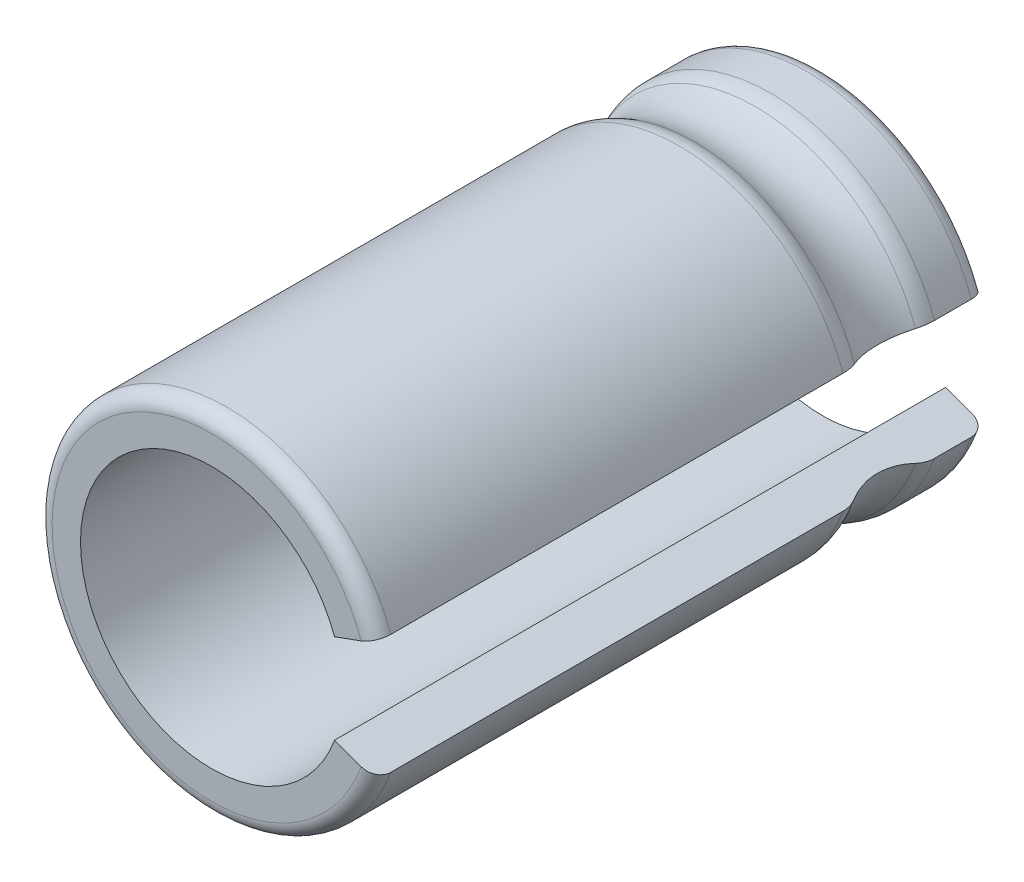
ISO-10303-21;
HEADER;
FILE_DESCRIPTION(('STEP AP214'),'2;1');
FILE_NAME('part.step','',(''),(''),'','','');
FILE_SCHEMA(('AUTOMOTIVE_DESIGN { 1 0 10303 214 1 1 1 1 }'));
ENDSEC;
DATA;
#1=APPLICATION_CONTEXT('core data for automotive mechanical design processes');
#2=APPLICATION_PROTOCOL_DEFINITION('international standard','automotive_design',2000,#1);
#3=PRODUCT_CONTEXT('',#1,'mechanical');
#4=PRODUCT('Part','Part','',(#3));
#5=PRODUCT_RELATED_PRODUCT_CATEGORY('part','',(#4));
#6=PRODUCT_DEFINITION_FORMATION('','',#4);
#7=PRODUCT_DEFINITION_CONTEXT('part definition',#1,'design');
#8=PRODUCT_DEFINITION('design','',#6,#7);
#9=PRODUCT_DEFINITION_SHAPE('','',#8);
#10=(LENGTH_UNIT() NAMED_UNIT(*) SI_UNIT(.MILLI.,.METRE.));
#11=(NAMED_UNIT(*) PLANE_ANGLE_UNIT() SI_UNIT($,.RADIAN.));
#12=(NAMED_UNIT(*) SI_UNIT($,.STERADIAN.) SOLID_ANGLE_UNIT());
#13=UNCERTAINTY_MEASURE_WITH_UNIT(LENGTH_MEASURE(1.E-05),#10,'distance_accuracy_value','');
#14=(GEOMETRIC_REPRESENTATION_CONTEXT(3) GLOBAL_UNCERTAINTY_ASSIGNED_CONTEXT((#13)) GLOBAL_UNIT_ASSIGNED_CONTEXT((#10,
#11,#12)) REPRESENTATION_CONTEXT('',''));
#15=CARTESIAN_POINT('',(0.,0.,0.));
#16=DIRECTION('',(0.,0.,1.));
#17=DIRECTION('',(1.,0.,0.));
#18=AXIS2_PLACEMENT_3D('',#15,#16,#17);
#19=CARTESIAN_POINT('',(-6.44883452194378E-13,0.,1.117236171027));
#20=DIRECTION('',(0.,0.,1.));
#21=DIRECTION('',(1.,0.,0.));
#22=AXIS2_PLACEMENT_3D('',#19,#20,#21);
#23=TOROIDAL_SURFACE('',#22,1.65000000000678,0.349999999994139);
#24=CARTESIAN_POINT('',(0.,0.,1.291846849077));
#25=DIRECTION('',(0.,0.,-1.));
#26=DIRECTION('',(0.,1.,0.));
#27=AXIS2_PLACEMENT_3D('',#24,#25,#26);
#28=CIRCLE('',#27,1.95333333333273);
#29=CARTESIAN_POINT('',(1.83553291926836,-0.668079346629729,1.29184684907559));
#30=VERTEX_POINT('',#29);
#31=CARTESIAN_POINT('',(1.83553291926847,0.668079346629759,1.29184684907565));
#32=VERTEX_POINT('',#31);
#33=EDGE_CURVE('E91',#30,#32,#28,.T.);
#34=ORIENTED_EDGE('',*,*,#33,.T.);
#35=CARTESIAN_POINT('',(1.55049282430246,0.564333236489703,1.117236171027));
#36=DIRECTION('',(0.342020143325687,-0.939692620785902,0.));
#37=DIRECTION('',(0.939692620785902,0.342020143325687,0.));
#38=AXIS2_PLACEMENT_3D('',#35,#36,#37);
#39=CIRCLE('',#38,0.349999999994139);
#40=CARTESIAN_POINT('',(1.87938524157191,0.684040286651308,1.117236171027));
#41=VERTEX_POINT('',#40);
#42=EDGE_CURVE('E21',#32,#41,#39,.F.);
#43=ORIENTED_EDGE('',*,*,#42,.T.);
#44=CARTESIAN_POINT('',(0.,0.,1.117236171027));
#45=DIRECTION('',(0.,0.,1.));
#46=DIRECTION('',(1.,0.,0.));
#47=AXIS2_PLACEMENT_3D('',#44,#45,#46);
#48=CIRCLE('',#47,2.);
#49=CARTESIAN_POINT('',(1.87938524157191,-0.684040286651314,1.117236171027));
#50=VERTEX_POINT('',#49);
#51=EDGE_CURVE('E143',#50,#41,#48,.F.);
#52=ORIENTED_EDGE('',*,*,#51,.F.);
#53=CARTESIAN_POINT('',(1.55049282430246,-0.564333236489712,1.117236171027));
#54=DIRECTION('',(-0.342020143325693,-0.9396926207859,0.));
#55=DIRECTION('',(0.9396926207859,-0.342020143325693,0.));
#56=AXIS2_PLACEMENT_3D('',#53,#54,#55);
#57=CIRCLE('',#56,0.349999999994139);
#58=EDGE_CURVE('E97',#50,#30,#57,.T.);
#59=ORIENTED_EDGE('',*,*,#58,.T.);
#60=EDGE_LOOP('',(#34,#43,#52,#59));
#61=FACE_BOUND('',#60,.T.);
#62=ADVANCED_FACE('F17',(#61),#23,.T.);
#63=CARTESIAN_POINT('',(0.,0.,1.6410682051755));
#64=DIRECTION('',(0.,0.,1.));
#65=DIRECTION('',(0.,-1.,0.));
#66=AXIS2_PLACEMENT_3D('',#63,#64,#65);
#67=TOROIDAL_SURFACE('',#66,2.56000000000191,0.700000000001982);
#68=ORIENTED_EDGE('',*,*,#33,.F.);
#69=CARTESIAN_POINT('',(2.4056131092136,-0.875571566914685,1.6410682051755));
#70=DIRECTION('',(-0.342020143325795,-0.939692620785862,0.));
#71=DIRECTION('',(0.939692620785863,-0.342020143325795,0.));
#72=AXIS2_PLACEMENT_3D('',#69,#70,#71);
#73=CIRCLE('',#72,0.700000000001982);
#74=CARTESIAN_POINT('',(1.83553291926836,-0.668079346629693,1.99028956127535));
#75=VERTEX_POINT('',#74);
#76=EDGE_CURVE('E101',#75,#30,#73,.T.);
#77=ORIENTED_EDGE('',*,*,#76,.F.);
#78=CARTESIAN_POINT('',(-6.41847686111419E-13,0.,1.990289561274));
#79=DIRECTION('',(0.,0.,1.));
#80=DIRECTION('',(1.,0.,0.));
#81=AXIS2_PLACEMENT_3D('',#78,#79,#80);
#82=CIRCLE('',#81,1.95333333333284);
#83=CARTESIAN_POINT('',(1.83553291926826,0.668079346629654,1.99028956127541));
#84=VERTEX_POINT('',#83);
#85=EDGE_CURVE('E107',#84,#75,#82,.T.);
#86=ORIENTED_EDGE('',*,*,#85,.F.);
#87=CARTESIAN_POINT('',(2.40561310921361,0.875571566914684,1.6410682051755));
#88=DIRECTION('',(0.342020143325793,-0.939692620785863,0.));
#89=DIRECTION('',(0.939692620785863,0.342020143325793,0.));
#90=AXIS2_PLACEMENT_3D('',#87,#88,#89);
#91=CIRCLE('',#90,0.700000000001982);
#92=EDGE_CURVE('E104',#32,#84,#91,.F.);
#93=ORIENTED_EDGE('',*,*,#92,.F.);
#94=EDGE_LOOP('',(#68,#77,#86,#93));
#95=FACE_BOUND('',#94,.T.);
#96=ADVANCED_FACE('F105',(#95),#67,.F.);
#97=CARTESIAN_POINT('',(0.,0.,0.871068205175));
#98=DIRECTION('',(0.,0.,1.));
#99=DIRECTION('',(1.,0.,0.));
#100=AXIS2_PLACEMENT_3D('',#97,#98,#99);
#101=CYLINDRICAL_SURFACE('',#100,2.);
#102=ORIENTED_EDGE('',*,*,#51,.T.);
#103=DIRECTION('',(0.,0.,1.));
#104=VECTOR('',#103,1.);
#105=CARTESIAN_POINT('',(1.87938524157195,0.684040286650981,0.871068205175));
#106=LINE('',#105,#104);
#107=CARTESIAN_POINT('',(1.879385241572,0.684040286651346,0.696068205175));
#108=VERTEX_POINT('',#107);
#109=EDGE_CURVE('E114',#41,#108,#106,.F.);
#110=ORIENTED_EDGE('',*,*,#109,.T.);
#111=CARTESIAN_POINT('',(8.56086035394554E-13,0.,0.696068205175));
#112=DIRECTION('',(0.,0.,-1.));
#113=DIRECTION('',(-1.,0.,0.));
#114=AXIS2_PLACEMENT_3D('',#111,#112,#113);
#115=CIRCLE('',#114,2.00000000000005);
#116=CARTESIAN_POINT('',(1.879385241572,-0.684040286651347,0.696068205175));
#117=VERTEX_POINT('',#116);
#118=EDGE_CURVE('E123',#117,#108,#115,.T.);
#119=ORIENTED_EDGE('',*,*,#118,.F.);
#120=DIRECTION('',(0.,0.,1.));
#121=VECTOR('',#120,1.);
#122=CARTESIAN_POINT('',(1.87938524157195,-0.684040286650982,0.871068205175));
#123=LINE('',#122,#121);
#124=EDGE_CURVE('E100',#117,#50,#123,.T.);
#125=ORIENTED_EDGE('',*,*,#124,.T.);
#126=EDGE_LOOP('',(#102,#110,#119,#125));
#127=FACE_BOUND('',#126,.T.);
#128=ADVANCED_FACE('F185',(#127),#101,.T.);
#129=CARTESIAN_POINT('',(8.56086035394554E-13,0.,2.164900239324));
#130=DIRECTION('',(0.,0.,1.));
#131=DIRECTION('',(1.,0.,0.));
#132=AXIS2_PLACEMENT_3D('',#129,#130,#131);
#133=TOROIDAL_SURFACE('',#132,1.65000000000537,0.34999999999414);
#134=CARTESIAN_POINT('',(1.55049282430249,-0.564333236489628,2.164900239324));
#135=DIRECTION('',(-0.342020143325935,-0.939692620785812,0.));
#136=DIRECTION('',(0.939692620785812,-0.342020143325935,0.));
#137=AXIS2_PLACEMENT_3D('',#134,#135,#136);
#138=CIRCLE('',#137,0.34999999999414);
#139=CARTESIAN_POINT('',(1.87938524157182,-0.68404028665163,2.164900239324));
#140=VERTEX_POINT('',#139);
#141=EDGE_CURVE('E119',#75,#140,#138,.T.);
#142=ORIENTED_EDGE('',*,*,#141,.T.);
#143=CARTESIAN_POINT('',(0.,0.,2.164900239324));
#144=DIRECTION('',(0.,0.,1.));
#145=DIRECTION('',(1.,0.,0.));
#146=AXIS2_PLACEMENT_3D('',#143,#144,#145);
#147=CIRCLE('',#146,2.);
#148=CARTESIAN_POINT('',(1.87938524157182,0.684040286651629,2.164900239324));
#149=VERTEX_POINT('',#148);
#150=EDGE_CURVE('E152',#149,#140,#147,.T.);
#151=ORIENTED_EDGE('',*,*,#150,.F.);
#152=CARTESIAN_POINT('',(1.55049282430249,0.564333236489627,2.164900239324));
#153=DIRECTION('',(0.342020143325934,-0.939692620785812,0.));
#154=DIRECTION('',(0.939692620785812,0.342020143325934,0.));
#155=AXIS2_PLACEMENT_3D('',#152,#153,#154);
#156=CIRCLE('',#155,0.34999999999414);
#157=EDGE_CURVE('E117',#149,#84,#156,.F.);
#158=ORIENTED_EDGE('',*,*,#157,.T.);
#159=ORIENTED_EDGE('',*,*,#85,.T.);
#160=EDGE_LOOP('',(#142,#151,#158,#159));
#161=FACE_BOUND('',#160,.T.);
#162=ADVANCED_FACE('F188',(#161),#133,.T.);
#163=CARTESIAN_POINT('',(8.56086035394554E-13,0.,0.696068205175));
#164=DIRECTION('',(0.,0.,1.));
#165=DIRECTION('',(1.,0.,0.));
#166=AXIS2_PLACEMENT_3D('',#163,#164,#165);
#167=TOROIDAL_SURFACE('',#166,1.82499999999881,0.175000000000221);
#168=CARTESIAN_POINT('',(1.71493903293384,-0.624186761569423,0.696068205175));
#169=DIRECTION('',(-0.342020143325935,-0.939692620785812,0.));
#170=DIRECTION('',(0.939692620785812,-0.342020143325935,0.));
#171=AXIS2_PLACEMENT_3D('',#168,#169,#170);
#172=CIRCLE('',#171,0.175000000000221);
#173=CARTESIAN_POINT('',(1.71493903293392,-0.624186761569212,0.521068205174999));
#174=VERTEX_POINT('',#173);
#175=EDGE_CURVE('E121',#174,#117,#172,.T.);
#176=ORIENTED_EDGE('',*,*,#175,.T.);
#177=ORIENTED_EDGE('',*,*,#118,.T.);
#178=CARTESIAN_POINT('',(1.71493903293385,0.624186761569423,0.696068205175));
#179=DIRECTION('',(0.342020143325933,-0.939692620785812,0.));
#180=DIRECTION('',(0.939692620785812,0.342020143325933,0.));
#181=AXIS2_PLACEMENT_3D('',#178,#179,#180);
#182=CIRCLE('',#181,0.175000000000221);
#183=CARTESIAN_POINT('',(1.71493903293392,0.624186761569211,0.521068205175));
#184=VERTEX_POINT('',#183);
#185=EDGE_CURVE('E124',#108,#184,#182,.F.);
#186=ORIENTED_EDGE('',*,*,#185,.T.);
#187=CARTESIAN_POINT('',(1.714939032934,-0.624186761569,0.521068205175));
#188=CARTESIAN_POINT('',(1.60823336737907,-0.916844181244438,0.521068205175));
#189=CARTESIAN_POINT('',(1.41080893173933,-1.15768871382733,0.521068205175));
#190=CARTESIAN_POINT('',(1.20088478741226,-1.41378205027014,0.521068205175));
#191=CARTESIAN_POINT('',(0.912500000000333,-1.58049636190633,0.521068205175));
#192=CARTESIAN_POINT('',(0.625879270241386,-1.74619087752644,0.521068205175));
#193=CARTESIAN_POINT('',(0.297183369979049,-1.80064073168644,0.521068205175));
#194=CARTESIAN_POINT('',(-0.00906607807898432,-1.85137223691676,0.521068205175));
#195=CARTESIAN_POINT('',(-0.316907924241667,-1.79727414924767,0.521068205175));
#196=CARTESIAN_POINT('',(-0.622715286092148,-1.74353358838026,0.521068205175));
#197=CARTESIAN_POINT('',(-0.895116420919333,-1.59040610945811,0.521068205175));
#198=CARTESIAN_POINT('',(-1.18377207209215,-1.42814132238677,0.521068205175));
#199=CARTESIAN_POINT('',(-1.39803110869233,-1.17308738767833,0.521068205175));
#200=CARTESIAN_POINT('',(-1.61097951970848,-0.919593621527738,0.521068205175));
#201=CARTESIAN_POINT('',(-1.72167960232422,-0.605346468512333,0.521068205175));
#202=CARTESIAN_POINT('',(-1.82482004056398,-0.312559071143259,0.521068205175));
#203=CARTESIAN_POINT('',(-1.82499999999967,-3.33392168039293E-13,0.521068205175));
#204=CARTESIAN_POINT('',(-1.82517877010826,0.310493411338437,0.521068205175));
#205=CARTESIAN_POINT('',(-1.72167960232444,0.605346468512444,0.521068205175));
#206=CARTESIAN_POINT('',(-1.61200450977718,0.917793776310604,0.521068205175));
#207=CARTESIAN_POINT('',(-1.398031108692,1.17308738767833,0.521068205175));
#208=CARTESIAN_POINT('',(-1.18536658595716,1.42681936437929,0.521068205175));
#209=CARTESIAN_POINT('',(-0.895116420919778,1.59040610945744,0.521068205175));
#210=CARTESIAN_POINT('',(-0.624687271153769,1.74282161068128,0.521068205175));
#211=CARTESIAN_POINT('',(-0.316907924242333,1.79727414924733,0.521068205175));
#212=CARTESIAN_POINT('',(-0.011162648604146,1.85136681849284,0.521068205175));
#213=CARTESIAN_POINT('',(0.297183369979111,1.80064073168589,0.521068205175));
#214=CARTESIAN_POINT('',(0.623928781065602,1.74688775584822,0.521068205175));
#215=CARTESIAN_POINT('',(0.912499999999667,1.580496361907,0.521068205175));
#216=CARTESIAN_POINT('',(1.19930624974728,1.41512265671617,0.521068205175));
#217=CARTESIAN_POINT('',(1.41080893173933,1.15768871382778,0.521068205175));
#218=CARTESIAN_POINT('',(1.6078759071354,0.917825426934783,0.521068205175));
#219=CARTESIAN_POINT('',(1.714939032934,0.624186761569,0.521068205175));
#220=B_SPLINE_CURVE_WITH_KNOTS('',2,(#187,#188,#189,#190,#191,#192,#193,#194,#195,#196,#197,
#198,#199,#200,#201,#202,#203,#204,#205,#206,#207,#208,#209,#210,#211,#212,#213,#214,#215,#216,
#217,#218,#219),.UNSPECIFIED.,.F.,.F.,(3,2,2,2,2,2,2,2,2,2,2,2,2,2,2,2,3),(0.,0.0625,0.125,
0.1875,0.25,0.3125,0.375,0.4375,0.5,0.5625,0.625,0.6875,0.75,0.8125,0.875,0.9375,1.),.UNSPECIFIED.);
#221=EDGE_CURVE('E158',#174,#184,#220,.T.);
#222=ORIENTED_EDGE('',*,*,#221,.F.);
#223=EDGE_LOOP('',(#176,#177,#186,#222));
#224=FACE_BOUND('',#223,.T.);
#225=ADVANCED_FACE('F183',(#224),#167,.T.);
#226=CARTESIAN_POINT('',(0.,0.,4.791068205175));
#227=DIRECTION('',(0.,0.,1.));
#228=DIRECTION('',(1.,0.,0.));
#229=AXIS2_PLACEMENT_3D('',#226,#227,#228);
#230=CYLINDRICAL_SURFACE('',#229,2.);
#231=ORIENTED_EDGE('',*,*,#150,.T.);
#232=DIRECTION('',(0.,0.,1.));
#233=VECTOR('',#232,1.);
#234=CARTESIAN_POINT('',(1.87938524157178,-0.684040286651612,4.047429708675));
#235=LINE('',#234,#233);
#236=CARTESIAN_POINT('',(1.87938524157191,-0.684040286651662,7.346068205175));
#237=VERTEX_POINT('',#236);
#238=EDGE_CURVE('E135',#237,#140,#235,.F.);
#239=ORIENTED_EDGE('',*,*,#238,.F.);
#240=CARTESIAN_POINT('',(8.52508168225352E-13,0.,7.346068205175));
#241=DIRECTION('',(0.,0.,1.));
#242=DIRECTION('',(1.,0.,0.));
#243=AXIS2_PLACEMENT_3D('',#240,#241,#242);
#244=CIRCLE('',#243,2.00000000000005);
#245=CARTESIAN_POINT('',(1.87938524157192,0.684040286651652,7.346068205175));
#246=VERTEX_POINT('',#245);
#247=EDGE_CURVE('E128',#246,#237,#244,.T.);
#248=ORIENTED_EDGE('',*,*,#247,.F.);
#249=DIRECTION('',(0.,0.,1.));
#250=VECTOR('',#249,1.);
#251=CARTESIAN_POINT('',(1.87938524157178,0.684040286651612,4.047429708675));
#252=LINE('',#251,#250);
#253=EDGE_CURVE('E131',#246,#149,#252,.F.);
#254=ORIENTED_EDGE('',*,*,#253,.T.);
#255=EDGE_LOOP('',(#231,#239,#248,#254));
#256=FACE_BOUND('',#255,.T.);
#257=ADVANCED_FACE('F180',(#256),#230,.T.);
#258=CARTESIAN_POINT('',(2.1618991319361E-13,0.,7.346068205175));
#259=DIRECTION('',(0.,0.,1.));
#260=DIRECTION('',(1.,0.,0.));
#261=AXIS2_PLACEMENT_3D('',#258,#259,#260);
#262=TOROIDAL_SURFACE('',#261,1.82499999999941,0.175000000000219);
#263=CARTESIAN_POINT('',(1.71493903293384,-0.624186761569442,7.346068205175));
#264=DIRECTION('',(-0.342020143325831,-0.939692620785849,0.));
#265=DIRECTION('',(0.939692620785849,-0.342020143325831,0.));
#266=AXIS2_PLACEMENT_3D('',#263,#264,#265);
#267=CIRCLE('',#266,0.175000000000219);
#268=CARTESIAN_POINT('',(1.71493903293392,-0.624186761569221,7.521068205175));
#269=VERTEX_POINT('',#268);
#270=EDGE_CURVE('E132',#269,#237,#267,.F.);
#271=ORIENTED_EDGE('',*,*,#270,.F.);
#272=CARTESIAN_POINT('',(1.714939032934,0.624186761569,7.521068205175));
#273=CARTESIAN_POINT('',(1.60823336738095,0.916844181242246,7.521068205175));
#274=CARTESIAN_POINT('',(1.41080893173922,1.15768871382744,7.521068205175));
#275=CARTESIAN_POINT('',(1.20088478741176,1.41378205027059,7.521068205175));
#276=CARTESIAN_POINT('',(0.912499999999667,1.58049636190633,7.521068205175));
#277=CARTESIAN_POINT('',(0.625879270239011,1.74619087752688,7.521068205175));
#278=CARTESIAN_POINT('',(0.297183369979021,1.80064073168644,7.521068205175));
#279=CARTESIAN_POINT('',(-0.00906607807896697,1.8513722369167,7.521068205175));
#280=CARTESIAN_POINT('',(-0.316907924242333,1.79727414924767,7.521068205175));
#281=CARTESIAN_POINT('',(-0.622715286091572,1.74353358838065,7.521068205175));
#282=CARTESIAN_POINT('',(-0.895116420919333,1.59040610945811,7.521068205175));
#283=CARTESIAN_POINT('',(-1.18377207209228,1.42814132238663,7.521068205175));
#284=CARTESIAN_POINT('',(-1.39803110869233,1.17308738767833,7.521068205175));
#285=CARTESIAN_POINT('',(-1.61097951970824,0.919593621528018,7.521068205175));
#286=CARTESIAN_POINT('',(-1.72167960232422,0.605346468512333,7.521068205175));
#287=CARTESIAN_POINT('',(-1.82482004056398,0.312559071143624,7.521068205175));
#288=CARTESIAN_POINT('',(-1.82499999999967,0.,7.521068205175));
#289=CARTESIAN_POINT('',(-1.82517877010826,-0.310493411339977,7.521068205175));
#290=CARTESIAN_POINT('',(-1.72167960232444,-0.605346468512333,7.521068205175));
#291=CARTESIAN_POINT('',(-1.61200450977616,-0.917793776311661,7.521068205175));
#292=CARTESIAN_POINT('',(-1.398031108692,-1.17308738767833,7.521068205175));
#293=CARTESIAN_POINT('',(-1.18536658595618,-1.42681936438063,7.521068205175));
#294=CARTESIAN_POINT('',(-0.895116420919667,-1.59040610945744,7.521068205175));
#295=CARTESIAN_POINT('',(-0.624687271151238,-1.74282161068185,7.521068205175));
#296=CARTESIAN_POINT('',(-0.316907924242333,-1.79727414924733,7.521068205175));
#297=CARTESIAN_POINT('',(-0.0111626486069413,-1.85136681849222,7.521068205175));
#298=CARTESIAN_POINT('',(0.297183369979111,-1.800640731686,7.521068205175));
#299=CARTESIAN_POINT('',(0.623928781062265,-1.74688775585015,7.521068205175));
#300=CARTESIAN_POINT('',(0.912499999999667,-1.580496361907,7.521068205175));
#301=CARTESIAN_POINT('',(1.19930624974923,-1.41512265671505,7.521068205175));
#302=CARTESIAN_POINT('',(1.41080893173933,-1.15768871382767,7.521068205175));
#303=CARTESIAN_POINT('',(1.60787590713898,-0.917825426929035,7.521068205175));
#304=CARTESIAN_POINT('',(1.714939032934,-0.624186761569,7.521068205175));
#305=B_SPLINE_CURVE_WITH_KNOTS('',2,(#272,#273,#274,#275,#276,#277,#278,#279,#280,#281,#282,
#283,#284,#285,#286,#287,#288,#289,#290,#291,#292,#293,#294,#295,#296,#297,#298,#299,#300,#301,
#302,#303,#304),.UNSPECIFIED.,.F.,.F.,(3,2,2,2,2,2,2,2,2,2,2,2,2,2,2,2,3),(0.,0.0625,0.125,
0.1875,0.25,0.3125,0.375,0.4375,0.5,0.5625,0.625,0.6875,0.75,0.8125,0.875,0.9375,1.),.UNSPECIFIED.);
#306=CARTESIAN_POINT('',(1.71493903293392,0.624186761569212,7.521068205175));
#307=VERTEX_POINT('',#306);
#308=EDGE_CURVE('E212',#307,#269,#305,.T.);
#309=ORIENTED_EDGE('',*,*,#308,.F.);
#310=CARTESIAN_POINT('',(1.71493903293385,0.624186761569424,7.346068205175));
#311=DIRECTION('',(0.342020143325821,-0.939692620785853,0.));
#312=DIRECTION('',(0.939692620785853,0.342020143325821,0.));
#313=AXIS2_PLACEMENT_3D('',#310,#311,#312);
#314=CIRCLE('',#313,0.175000000000219);
#315=EDGE_CURVE('E127',#307,#246,#314,.F.);
#316=ORIENTED_EDGE('',*,*,#315,.T.);
#317=ORIENTED_EDGE('',*,*,#247,.T.);
#318=EDGE_LOOP('',(#271,#309,#316,#317));
#319=FACE_BOUND('',#318,.T.);
#320=ADVANCED_FACE('F19',(#319),#262,.T.);
#321=CARTESIAN_POINT('',(1.637893575607,0.596144508417,4.047429708675));
#322=DIRECTION('',(-0.342020143325932,0.939692620785813,0.));
#323=DIRECTION('',(-0.939692620785813,-0.342020143325932,0.));
#324=AXIS2_PLACEMENT_3D('',#321,#322,#323);
#325=PLANE('',#324);
#326=ORIENTED_EDGE('',*,*,#157,.F.);
#327=ORIENTED_EDGE('',*,*,#253,.F.);
#328=ORIENTED_EDGE('',*,*,#315,.F.);
#329=DIRECTION('',(0.93969262078659,0.342020143323796,0.));
#330=VECTOR('',#329,1.);
#331=CARTESIAN_POINT('',(1.409538931179,0.513030214989,7.521068205175));
#332=LINE('',#331,#330);
#333=CARTESIAN_POINT('',(1.40953893117872,0.513030214988898,7.521068205175));
#334=VERTEX_POINT('',#333);
#335=EDGE_CURVE('E215',#334,#307,#332,.T.);
#336=ORIENTED_EDGE('',*,*,#335,.F.);
#337=DIRECTION('',(0.,0.,1.));
#338=VECTOR('',#337,1.);
#339=CARTESIAN_POINT('',(1.40953893117872,0.513030214988898,4.021068205175));
#340=LINE('',#339,#338);
#341=CARTESIAN_POINT('',(1.40953893117872,0.513030214988898,0.521068205175));
#342=VERTEX_POINT('',#341);
#343=EDGE_CURVE('E139',#334,#342,#340,.F.);
#344=ORIENTED_EDGE('',*,*,#343,.T.);
#345=DIRECTION('',(-0.93969262078659,-0.342020143323796,0.));
#346=VECTOR('',#345,1.);
#347=CARTESIAN_POINT('',(1.714939032934,0.624186761569,0.521068205175));
#348=LINE('',#347,#346);
#349=EDGE_CURVE('E159',#184,#342,#348,.T.);
#350=ORIENTED_EDGE('',*,*,#349,.F.);
#351=ORIENTED_EDGE('',*,*,#185,.F.);
#352=ORIENTED_EDGE('',*,*,#109,.F.);
#353=ORIENTED_EDGE('',*,*,#42,.F.);
#354=ORIENTED_EDGE('',*,*,#92,.T.);
#355=EDGE_LOOP('',(#326,#327,#328,#336,#344,#350,#351,#352,#353,#354));
#356=FACE_BOUND('',#355,.T.);
#357=ADVANCED_FACE('F112',(#356),#325,.F.);
#358=CARTESIAN_POINT('',(1.879385241572,0.684040286651,0.521068205175));
#359=DIRECTION('',(0.,0.,-1.));
#360=DIRECTION('',(-1.,0.,0.));
#361=AXIS2_PLACEMENT_3D('',#358,#359,#360);
#362=PLANE('',#361);
#363=ORIENTED_EDGE('',*,*,#221,.T.);
#364=ORIENTED_EDGE('',*,*,#349,.T.);
#365=CARTESIAN_POINT('',(0.,0.,0.521068205175));
#366=DIRECTION('',(0.,0.,1.));
#367=DIRECTION('',(1.,0.,0.));
#368=AXIS2_PLACEMENT_3D('',#365,#366,#367);
#369=CIRCLE('',#368,1.5);
#370=CARTESIAN_POINT('',(1.40953893117877,-0.513030214988763,0.521068205175));
#371=VERTEX_POINT('',#370);
#372=EDGE_CURVE('E137',#342,#371,#369,.T.);
#373=ORIENTED_EDGE('',*,*,#372,.T.);
#374=DIRECTION('',(-0.939692620785813,0.342020143325932,0.));
#375=VECTOR('',#374,1.);
#376=CARTESIAN_POINT('',(1.637893575607,-0.596144508417,0.521068205174998));
#377=LINE('',#376,#375);
#378=EDGE_CURVE('E136',#174,#371,#377,.T.);
#379=ORIENTED_EDGE('',*,*,#378,.F.);
#380=EDGE_LOOP('',(#363,#364,#373,#379));
#381=FACE_BOUND('',#380,.T.);
#382=ADVANCED_FACE('F165',(#381),#362,.T.);
#383=CARTESIAN_POINT('',(1.637893575607,-0.596144508417,4.047429708675));
#384=DIRECTION('',(0.342020143325932,0.939692620785813,0.));
#385=DIRECTION('',(-0.939692620785813,0.342020143325932,0.));
#386=AXIS2_PLACEMENT_3D('',#383,#384,#385);
#387=PLANE('',#386);
#388=ORIENTED_EDGE('',*,*,#270,.T.);
#389=ORIENTED_EDGE('',*,*,#238,.T.);
#390=ORIENTED_EDGE('',*,*,#141,.F.);
#391=ORIENTED_EDGE('',*,*,#76,.T.);
#392=ORIENTED_EDGE('',*,*,#58,.F.);
#393=ORIENTED_EDGE('',*,*,#124,.F.);
#394=ORIENTED_EDGE('',*,*,#175,.F.);
#395=ORIENTED_EDGE('',*,*,#378,.T.);
#396=DIRECTION('',(0.,0.,1.));
#397=VECTOR('',#396,1.);
#398=CARTESIAN_POINT('',(1.40953893117872,-0.513030214988898,4.021068205175));
#399=LINE('',#398,#397);
#400=CARTESIAN_POINT('',(1.40953893117872,-0.513030214988898,7.521068205175));
#401=VERTEX_POINT('',#400);
#402=EDGE_CURVE('E27',#371,#401,#399,.T.);
#403=ORIENTED_EDGE('',*,*,#402,.T.);
#404=DIRECTION('',(-0.93969262078659,0.342020143323796,0.));
#405=VECTOR('',#404,1.);
#406=CARTESIAN_POINT('',(1.714939032934,-0.624186761569,7.521068205175));
#407=LINE('',#406,#405);
#408=EDGE_CURVE('E35',#269,#401,#407,.T.);
#409=ORIENTED_EDGE('',*,*,#408,.F.);
#410=EDGE_LOOP('',(#388,#389,#390,#391,#392,#393,#394,#395,#403,#409));
#411=FACE_BOUND('',#410,.T.);
#412=ADVANCED_FACE('F175',(#411),#387,.T.);
#413=CARTESIAN_POINT('',(1.409538931179,0.513030214989,7.521068205175));
#414=DIRECTION('',(0.,0.,1.));
#415=DIRECTION('',(1.,0.,0.));
#416=AXIS2_PLACEMENT_3D('',#413,#414,#415);
#417=PLANE('',#416);
#418=ORIENTED_EDGE('',*,*,#308,.T.);
#419=ORIENTED_EDGE('',*,*,#408,.T.);
#420=CARTESIAN_POINT('',(0.,0.,7.521068205175));
#421=DIRECTION('',(0.,0.,1.));
#422=DIRECTION('',(1.,0.,0.));
#423=AXIS2_PLACEMENT_3D('',#420,#421,#422);
#424=CIRCLE('',#423,1.5);
#425=EDGE_CURVE('E11',#401,#334,#424,.F.);
#426=ORIENTED_EDGE('',*,*,#425,.T.);
#427=ORIENTED_EDGE('',*,*,#335,.T.);
#428=EDGE_LOOP('',(#418,#419,#426,#427));
#429=FACE_BOUND('',#428,.T.);
#430=ADVANCED_FACE('F203',(#429),#417,.T.);
#431=CARTESIAN_POINT('',(0.,0.,4.021068205175));
#432=DIRECTION('',(0.,0.,1.));
#433=DIRECTION('',(1.,0.,0.));
#434=AXIS2_PLACEMENT_3D('',#431,#432,#433);
#435=CYLINDRICAL_SURFACE('',#434,1.5);
#436=ORIENTED_EDGE('',*,*,#402,.F.);
#437=ORIENTED_EDGE('',*,*,#372,.F.);
#438=ORIENTED_EDGE('',*,*,#343,.F.);
#439=ORIENTED_EDGE('',*,*,#425,.F.);
#440=EDGE_LOOP('',(#436,#437,#438,#439));
#441=FACE_BOUND('',#440,.T.);
#442=ADVANCED_FACE('F201',(#441),#435,.F.);
#443=CLOSED_SHELL('',(#62,#96,#128,#162,#225,#257,#320,#357,#382,#412,#430,#442));
#444=MANIFOLD_SOLID_BREP('B1',#443);
#445=ADVANCED_BREP_SHAPE_REPRESENTATION('',(#18,#444),#14);
#446=SHAPE_DEFINITION_REPRESENTATION(#9,#445);
ENDSEC;
END-ISO-10303-21;
